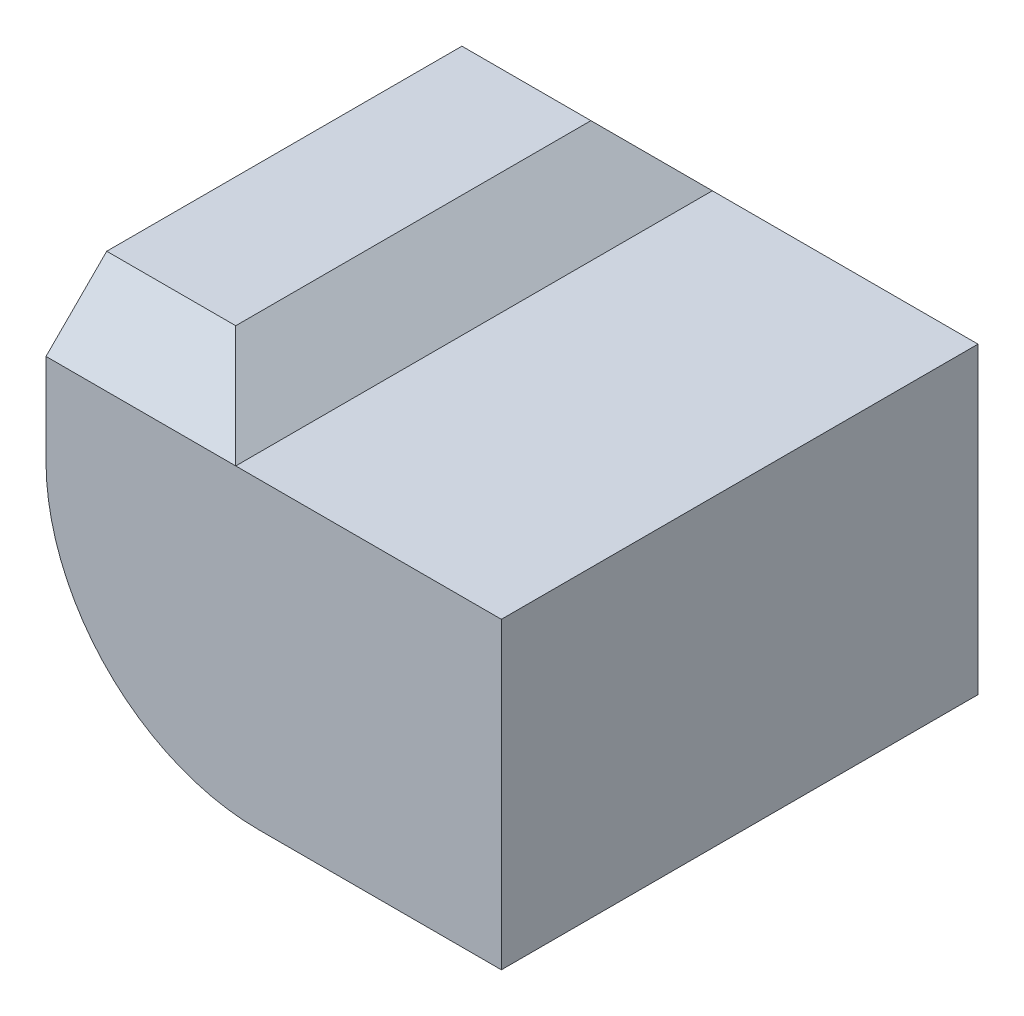
ISO-10303-21;
HEADER;
FILE_DESCRIPTION(('STEP AP214'),'2;1');
FILE_NAME('part.step','',(''),(''),'','','');
FILE_SCHEMA(('AUTOMOTIVE_DESIGN { 1 0 10303 214 1 1 1 1 }'));
ENDSEC;
DATA;
#1=APPLICATION_CONTEXT('core data for automotive mechanical design processes');
#2=APPLICATION_PROTOCOL_DEFINITION('international standard','automotive_design',2000,#1);
#3=PRODUCT_CONTEXT('',#1,'mechanical');
#4=PRODUCT('Part','Part','',(#3));
#5=PRODUCT_RELATED_PRODUCT_CATEGORY('part','',(#4));
#6=PRODUCT_DEFINITION_FORMATION('','',#4);
#7=PRODUCT_DEFINITION_CONTEXT('part definition',#1,'design');
#8=PRODUCT_DEFINITION('design','',#6,#7);
#9=PRODUCT_DEFINITION_SHAPE('','',#8);
#10=(LENGTH_UNIT() NAMED_UNIT(*) SI_UNIT(.MILLI.,.METRE.));
#11=(NAMED_UNIT(*) PLANE_ANGLE_UNIT() SI_UNIT($,.RADIAN.));
#12=(NAMED_UNIT(*) SI_UNIT($,.STERADIAN.) SOLID_ANGLE_UNIT());
#13=UNCERTAINTY_MEASURE_WITH_UNIT(LENGTH_MEASURE(1.E-05),#10,'distance_accuracy_value','');
#14=(GEOMETRIC_REPRESENTATION_CONTEXT(3) GLOBAL_UNCERTAINTY_ASSIGNED_CONTEXT((#13)) GLOBAL_UNIT_ASSIGNED_CONTEXT((#10,
#11,#12)) REPRESENTATION_CONTEXT('',''));
#15=CARTESIAN_POINT('',(0.,0.,0.));
#16=DIRECTION('',(0.,0.,1.));
#17=DIRECTION('',(1.,0.,0.));
#18=AXIS2_PLACEMENT_3D('',#15,#16,#17);
#19=CARTESIAN_POINT('',(-175.,90.,423.));
#20=DIRECTION('',(0.,-1.,0.));
#21=DIRECTION('',(1.,0.,0.));
#22=AXIS2_PLACEMENT_3D('',#19,#20,#21);
#23=PLANE('',#22);
#24=DIRECTION('',(0.,0.,1.));
#25=VECTOR('',#24,1.);
#26=CARTESIAN_POINT('',(-90.,90.,423.));
#27=LINE('',#26,#25);
#28=CARTESIAN_POINT('',(-90.,90.,-117.));
#29=VERTEX_POINT('',#28);
#30=CARTESIAN_POINT('',(-90.,90.,117.));
#31=VERTEX_POINT('',#30);
#32=EDGE_CURVE('E170',#29,#31,#27,.T.);
#33=ORIENTED_EDGE('',*,*,#32,.F.);
#34=DIRECTION('',(-1.,0.,0.));
#35=VECTOR('',#34,1.);
#36=CARTESIAN_POINT('',(-175.,90.,-117.));
#37=LINE('',#36,#35);
#38=CARTESIAN_POINT('',(-175.,90.,-117.));
#39=VERTEX_POINT('',#38);
#40=EDGE_CURVE('E165',#29,#39,#37,.T.);
#41=ORIENTED_EDGE('',*,*,#40,.T.);
#42=DIRECTION('',(0.,0.,-1.));
#43=VECTOR('',#42,1.);
#44=CARTESIAN_POINT('',(-175.,90.,423.));
#45=LINE('',#44,#43);
#46=CARTESIAN_POINT('',(-175.,90.,117.));
#47=VERTEX_POINT('',#46);
#48=EDGE_CURVE('E167',#47,#39,#45,.T.);
#49=ORIENTED_EDGE('',*,*,#48,.F.);
#50=DIRECTION('',(-1.,0.,0.));
#51=VECTOR('',#50,1.);
#52=CARTESIAN_POINT('',(0.,90.,117.));
#53=LINE('',#52,#51);
#54=EDGE_CURVE('E125',#31,#47,#53,.T.);
#55=ORIENTED_EDGE('',*,*,#54,.F.);
#56=EDGE_LOOP('',(#33,#41,#49,#55));
#57=FACE_BOUND('',#56,.T.);
#58=ADVANCED_FACE('F37',(#57),#23,.F.);
#59=CARTESIAN_POINT('',(-175.,-150.,-117.));
#60=DIRECTION('',(0.,-1.,0.));
#61=DIRECTION('',(0.,0.,-1.));
#62=AXIS2_PLACEMENT_3D('',#59,#60,#61);
#63=PLANE('',#62);
#64=DIRECTION('',(1.,0.,0.));
#65=VECTOR('',#64,1.);
#66=CARTESIAN_POINT('',(-175.,-150.,157.));
#67=LINE('',#66,#65);
#68=CARTESIAN_POINT('',(-35.,-150.,157.));
#69=VERTEX_POINT('',#68);
#70=CARTESIAN_POINT('',(125.,-150.,157.));
#71=VERTEX_POINT('',#70);
#72=EDGE_CURVE('E60',#69,#71,#67,.T.);
#73=ORIENTED_EDGE('',*,*,#72,.F.);
#74=DIRECTION('',(0.,0.,1.));
#75=VECTOR('',#74,1.);
#76=CARTESIAN_POINT('',(-35.,-150.,-117.));
#77=LINE('',#76,#75);
#78=CARTESIAN_POINT('',(-35.,-150.,-157.));
#79=VERTEX_POINT('',#78);
#80=EDGE_CURVE('E136',#69,#79,#77,.F.);
#81=ORIENTED_EDGE('',*,*,#80,.T.);
#82=DIRECTION('',(-1.,0.,0.));
#83=VECTOR('',#82,1.);
#84=CARTESIAN_POINT('',(-175.,-150.,-157.));
#85=LINE('',#84,#83);
#86=CARTESIAN_POINT('',(125.,-150.,-157.));
#87=VERTEX_POINT('',#86);
#88=EDGE_CURVE('E152',#87,#79,#85,.T.);
#89=ORIENTED_EDGE('',*,*,#88,.F.);
#90=DIRECTION('',(0.,0.,-1.));
#91=VECTOR('',#90,1.);
#92=CARTESIAN_POINT('',(125.,-150.,402.));
#93=LINE('',#92,#91);
#94=EDGE_CURVE('E146',#71,#87,#93,.T.);
#95=ORIENTED_EDGE('',*,*,#94,.F.);
#96=EDGE_LOOP('',(#73,#81,#89,#95));
#97=FACE_BOUND('',#96,.T.);
#98=ADVANCED_FACE('F189',(#97),#63,.T.);
#99=CARTESIAN_POINT('',(-175.,-150.,-117.));
#100=DIRECTION('',(-1.,0.,0.));
#101=DIRECTION('',(0.,0.,1.));
#102=AXIS2_PLACEMENT_3D('',#99,#100,#101);
#103=PLANE('',#102);
#104=DIRECTION('',(0.,-1.,0.));
#105=VECTOR('',#104,1.);
#106=CARTESIAN_POINT('',(-175.,50.,157.));
#107=LINE('',#106,#105);
#108=CARTESIAN_POINT('',(-175.,50.,157.));
#109=VERTEX_POINT('',#108);
#110=CARTESIAN_POINT('',(-175.,-9.99999999999998,157.));
#111=VERTEX_POINT('',#110);
#112=EDGE_CURVE('E102',#109,#111,#107,.T.);
#113=ORIENTED_EDGE('',*,*,#112,.F.);
#114=DIRECTION('',(0.,0.707106781186551,-0.707106781186544));
#115=VECTOR('',#114,1.);
#116=CARTESIAN_POINT('',(-175.,90.0000000000003,117.));
#117=LINE('',#116,#115);
#118=EDGE_CURVE('E116',#109,#47,#117,.T.);
#119=ORIENTED_EDGE('',*,*,#118,.T.);
#120=ORIENTED_EDGE('',*,*,#48,.T.);
#121=DIRECTION('',(0.,0.707106781186544,0.707106781186551));
#122=VECTOR('',#121,1.);
#123=CARTESIAN_POINT('',(-175.,50.,-157.));
#124=LINE('',#123,#122);
#125=CARTESIAN_POINT('',(-175.,50.,-157.));
#126=VERTEX_POINT('',#125);
#127=EDGE_CURVE('E128',#39,#126,#124,.F.);
#128=ORIENTED_EDGE('',*,*,#127,.T.);
#129=DIRECTION('',(0.,1.,0.));
#130=VECTOR('',#129,1.);
#131=CARTESIAN_POINT('',(-175.,50.,-157.));
#132=LINE('',#131,#130);
#133=CARTESIAN_POINT('',(-175.,-9.99999999999998,-157.));
#134=VERTEX_POINT('',#133);
#135=EDGE_CURVE('E157',#134,#126,#132,.T.);
#136=ORIENTED_EDGE('',*,*,#135,.F.);
#137=DIRECTION('',(0.,0.,1.));
#138=VECTOR('',#137,1.);
#139=CARTESIAN_POINT('',(-175.,-9.99999999999998,-117.));
#140=LINE('',#139,#138);
#141=EDGE_CURVE('E120',#134,#111,#140,.T.);
#142=ORIENTED_EDGE('',*,*,#141,.T.);
#143=EDGE_LOOP('',(#113,#119,#120,#128,#136,#142));
#144=FACE_BOUND('',#143,.T.);
#145=ADVANCED_FACE('F114',(#144),#103,.T.);
#146=CARTESIAN_POINT('',(0.,50.,200.));
#147=DIRECTION('',(0.,1.,0.));
#148=DIRECTION('',(-1.,0.,0.));
#149=AXIS2_PLACEMENT_3D('',#146,#147,#148);
#150=PLANE('',#149);
#151=DIRECTION('',(-1.,0.,0.));
#152=VECTOR('',#151,1.);
#153=CARTESIAN_POINT('',(427.,50.,157.));
#154=LINE('',#153,#152);
#155=CARTESIAN_POINT('',(125.,50.,157.));
#156=VERTEX_POINT('',#155);
#157=CARTESIAN_POINT('',(-49.9999999999997,50.,157.));
#158=VERTEX_POINT('',#157);
#159=EDGE_CURVE('E105',#156,#158,#154,.T.);
#160=ORIENTED_EDGE('',*,*,#159,.F.);
#161=DIRECTION('',(0.,0.,1.));
#162=VECTOR('',#161,1.);
#163=CARTESIAN_POINT('',(125.,50.,200.));
#164=LINE('',#163,#162);
#165=CARTESIAN_POINT('',(125.,50.,-157.));
#166=VERTEX_POINT('',#165);
#167=EDGE_CURVE('E139',#166,#156,#164,.T.);
#168=ORIENTED_EDGE('',*,*,#167,.F.);
#169=DIRECTION('',(-1.,0.,0.));
#170=VECTOR('',#169,1.);
#171=CARTESIAN_POINT('',(427.,50.,-157.));
#172=LINE('',#171,#170);
#173=CARTESIAN_POINT('',(-49.9999999999997,50.,-157.));
#174=VERTEX_POINT('',#173);
#175=EDGE_CURVE('E52',#166,#174,#172,.T.);
#176=ORIENTED_EDGE('',*,*,#175,.T.);
#177=DIRECTION('',(0.,0.,1.));
#178=VECTOR('',#177,1.);
#179=CARTESIAN_POINT('',(-49.9999999999997,50.,117.));
#180=LINE('',#179,#178);
#181=EDGE_CURVE('E151',#174,#158,#180,.T.);
#182=ORIENTED_EDGE('',*,*,#181,.T.);
#183=EDGE_LOOP('',(#160,#168,#176,#182));
#184=FACE_BOUND('',#183,.T.);
#185=ADVANCED_FACE('F149',(#184),#150,.T.);
#186=CARTESIAN_POINT('',(-49.9999999999997,50.,200.));
#187=DIRECTION('',(0.707106781186551,0.707106781186544,0.));
#188=DIRECTION('',(0.,0.,-1.));
#189=AXIS2_PLACEMENT_3D('',#186,#187,#188);
#190=PLANE('',#189);
#191=ORIENTED_EDGE('',*,*,#181,.F.);
#192=DIRECTION('',(-0.57735026918962,0.577350269189626,0.577350269189632));
#193=VECTOR('',#192,1.);
#194=CARTESIAN_POINT('',(-169.,169.000000000001,-37.9999999999979));
#195=LINE('',#194,#193);
#196=EDGE_CURVE('E126',#174,#29,#195,.T.);
#197=ORIENTED_EDGE('',*,*,#196,.T.);
#198=ORIENTED_EDGE('',*,*,#32,.T.);
#199=DIRECTION('',(-0.577350269189624,0.57735026918963,-0.577350269189624));
#200=VECTOR('',#199,1.);
#201=CARTESIAN_POINT('',(-35.6666666666664,35.6666666666666,171.333333333333));
#202=LINE('',#201,#200);
#203=EDGE_CURVE('E109',#31,#158,#202,.F.);
#204=ORIENTED_EDGE('',*,*,#203,.T.);
#205=EDGE_LOOP('',(#191,#197,#198,#204));
#206=FACE_BOUND('',#205,.T.);
#207=ADVANCED_FACE('F183',(#206),#190,.T.);
#208=CARTESIAN_POINT('',(0.,90.0000000000003,117.));
#209=DIRECTION('',(0.,-0.707106781186544,-0.707106781186551));
#210=DIRECTION('',(1.,0.,0.));
#211=AXIS2_PLACEMENT_3D('',#208,#209,#210);
#212=PLANE('',#211);
#213=ORIENTED_EDGE('',*,*,#118,.F.);
#214=DIRECTION('',(-1.,0.,0.));
#215=VECTOR('',#214,1.);
#216=CARTESIAN_POINT('',(0.,50.,157.));
#217=LINE('',#216,#215);
#218=EDGE_CURVE('E99',#158,#109,#217,.T.);
#219=ORIENTED_EDGE('',*,*,#218,.F.);
#220=ORIENTED_EDGE('',*,*,#203,.F.);
#221=ORIENTED_EDGE('',*,*,#54,.T.);
#222=EDGE_LOOP('',(#213,#219,#220,#221));
#223=FACE_BOUND('',#222,.T.);
#224=ADVANCED_FACE('F123',(#223),#212,.F.);
#225=CARTESIAN_POINT('',(0.,50.,-157.));
#226=DIRECTION('',(0.,0.707106781186551,-0.707106781186544));
#227=DIRECTION('',(-1.,0.,0.));
#228=AXIS2_PLACEMENT_3D('',#225,#226,#227);
#229=PLANE('',#228);
#230=ORIENTED_EDGE('',*,*,#127,.F.);
#231=ORIENTED_EDGE('',*,*,#40,.F.);
#232=ORIENTED_EDGE('',*,*,#196,.F.);
#233=DIRECTION('',(1.,0.,0.));
#234=VECTOR('',#233,1.);
#235=CARTESIAN_POINT('',(-49.9999999999997,50.,-157.));
#236=LINE('',#235,#234);
#237=EDGE_CURVE('E110',#126,#174,#236,.T.);
#238=ORIENTED_EDGE('',*,*,#237,.F.);
#239=EDGE_LOOP('',(#230,#231,#232,#238));
#240=FACE_BOUND('',#239,.T.);
#241=ADVANCED_FACE('F179',(#240),#229,.T.);
#242=CARTESIAN_POINT('',(-35.,-9.99999999999998,-117.));
#243=DIRECTION('',(0.,0.,1.));
#244=DIRECTION('',(1.,0.,0.));
#245=AXIS2_PLACEMENT_3D('',#242,#243,#244);
#246=CYLINDRICAL_SURFACE('',#245,140.);
#247=CARTESIAN_POINT('',(-35.,-9.99999999999998,157.));
#248=DIRECTION('',(0.,0.,-1.));
#249=DIRECTION('',(-1.,0.,0.));
#250=AXIS2_PLACEMENT_3D('',#247,#248,#249);
#251=CIRCLE('',#250,140.);
#252=EDGE_CURVE('E162',#111,#69,#251,.F.);
#253=ORIENTED_EDGE('',*,*,#252,.F.);
#254=ORIENTED_EDGE('',*,*,#141,.F.);
#255=CARTESIAN_POINT('',(-35.,-9.99999999999998,-157.));
#256=DIRECTION('',(0.,0.,1.));
#257=DIRECTION('',(1.,0.,0.));
#258=AXIS2_PLACEMENT_3D('',#255,#256,#257);
#259=CIRCLE('',#258,140.);
#260=EDGE_CURVE('E154',#79,#134,#259,.F.);
#261=ORIENTED_EDGE('',*,*,#260,.F.);
#262=ORIENTED_EDGE('',*,*,#80,.F.);
#263=EDGE_LOOP('',(#253,#254,#261,#262));
#264=FACE_BOUND('',#263,.T.);
#265=ADVANCED_FACE('F39',(#264),#246,.T.);
#266=CARTESIAN_POINT('',(125.,50.,402.));
#267=DIRECTION('',(-1.,0.,0.));
#268=DIRECTION('',(0.,-1.,0.));
#269=AXIS2_PLACEMENT_3D('',#266,#267,#268);
#270=PLANE('',#269);
#271=ORIENTED_EDGE('',*,*,#167,.T.);
#272=DIRECTION('',(0.,-1.,0.));
#273=VECTOR('',#272,1.);
#274=CARTESIAN_POINT('',(125.,50.,157.));
#275=LINE('',#274,#273);
#276=EDGE_CURVE('E11',#156,#71,#275,.T.);
#277=ORIENTED_EDGE('',*,*,#276,.T.);
#278=ORIENTED_EDGE('',*,*,#94,.T.);
#279=DIRECTION('',(0.,1.,0.));
#280=VECTOR('',#279,1.);
#281=CARTESIAN_POINT('',(125.,50.,-157.));
#282=LINE('',#281,#280);
#283=EDGE_CURVE('E45',#87,#166,#282,.T.);
#284=ORIENTED_EDGE('',*,*,#283,.T.);
#285=EDGE_LOOP('',(#271,#277,#278,#284));
#286=FACE_BOUND('',#285,.T.);
#287=ADVANCED_FACE('F144',(#286),#270,.F.);
#288=CARTESIAN_POINT('',(427.,50.,-157.));
#289=DIRECTION('',(0.,0.,1.));
#290=DIRECTION('',(1.,0.,0.));
#291=AXIS2_PLACEMENT_3D('',#288,#289,#290);
#292=PLANE('',#291);
#293=ORIENTED_EDGE('',*,*,#260,.T.);
#294=ORIENTED_EDGE('',*,*,#135,.T.);
#295=ORIENTED_EDGE('',*,*,#237,.T.);
#296=ORIENTED_EDGE('',*,*,#175,.F.);
#297=ORIENTED_EDGE('',*,*,#283,.F.);
#298=ORIENTED_EDGE('',*,*,#88,.T.);
#299=EDGE_LOOP('',(#293,#294,#295,#296,#297,#298));
#300=FACE_BOUND('',#299,.T.);
#301=ADVANCED_FACE('F175',(#300),#292,.F.);
#302=CARTESIAN_POINT('',(427.,50.,157.));
#303=DIRECTION('',(0.,0.,-1.));
#304=DIRECTION('',(-1.,0.,0.));
#305=AXIS2_PLACEMENT_3D('',#302,#303,#304);
#306=PLANE('',#305);
#307=ORIENTED_EDGE('',*,*,#252,.T.);
#308=ORIENTED_EDGE('',*,*,#72,.T.);
#309=ORIENTED_EDGE('',*,*,#276,.F.);
#310=ORIENTED_EDGE('',*,*,#159,.T.);
#311=ORIENTED_EDGE('',*,*,#218,.T.);
#312=ORIENTED_EDGE('',*,*,#112,.T.);
#313=EDGE_LOOP('',(#307,#308,#309,#310,#311,#312));
#314=FACE_BOUND('',#313,.T.);
#315=ADVANCED_FACE('F101',(#314),#306,.F.);
#316=CLOSED_SHELL('',(#58,#98,#145,#185,#207,#224,#241,#265,#287,#301,#315));
#317=MANIFOLD_SOLID_BREP('B2',#316);
#318=ADVANCED_BREP_SHAPE_REPRESENTATION('',(#18,#317),#14);
#319=SHAPE_DEFINITION_REPRESENTATION(#9,#318);
ENDSEC;
END-ISO-10303-21;
